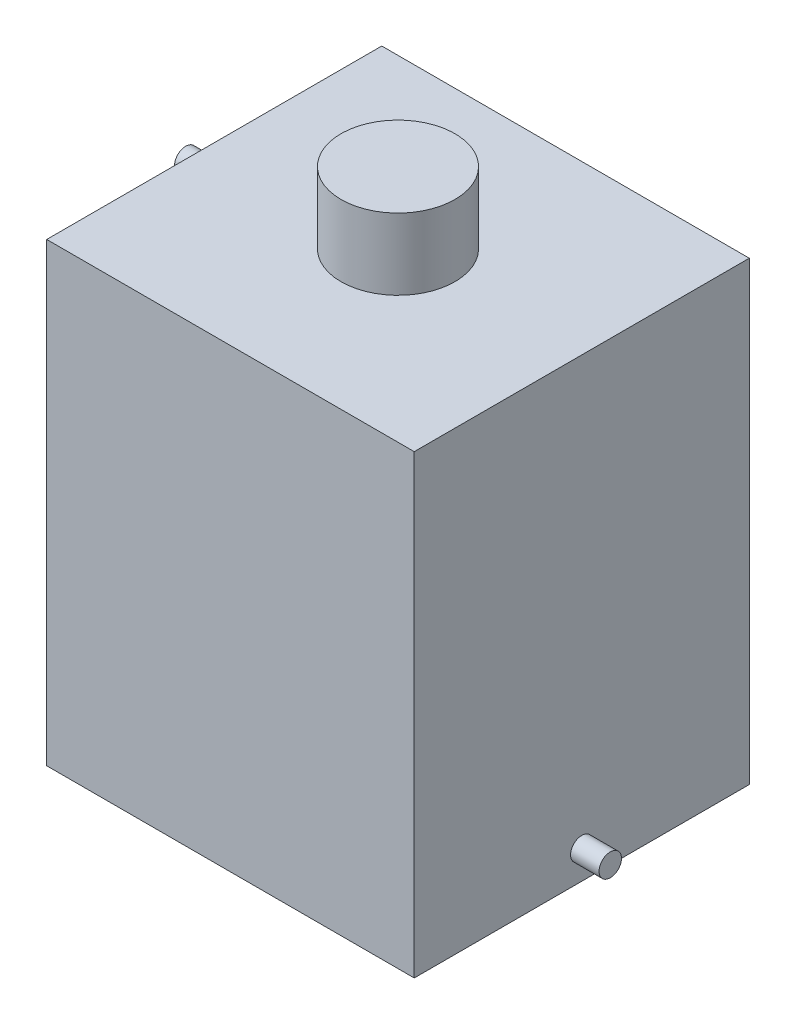
ISO-10303-21;
HEADER;
FILE_DESCRIPTION(('STEP AP214'),'2;1');
FILE_NAME('part.step','',(''),(''),'','','');
FILE_SCHEMA(('AUTOMOTIVE_DESIGN { 1 0 10303 214 1 1 1 1 }'));
ENDSEC;
DATA;
#1=APPLICATION_CONTEXT('core data for automotive mechanical design processes');
#2=APPLICATION_PROTOCOL_DEFINITION('international standard','automotive_design',2000,#1);
#3=PRODUCT_CONTEXT('',#1,'mechanical');
#4=PRODUCT('Part','Part','',(#3));
#5=PRODUCT_RELATED_PRODUCT_CATEGORY('part','',(#4));
#6=PRODUCT_DEFINITION_FORMATION('','',#4);
#7=PRODUCT_DEFINITION_CONTEXT('part definition',#1,'design');
#8=PRODUCT_DEFINITION('design','',#6,#7);
#9=PRODUCT_DEFINITION_SHAPE('','',#8);
#10=(LENGTH_UNIT() NAMED_UNIT(*) SI_UNIT(.MILLI.,.METRE.));
#11=(NAMED_UNIT(*) PLANE_ANGLE_UNIT() SI_UNIT($,.RADIAN.));
#12=(NAMED_UNIT(*) SI_UNIT($,.STERADIAN.) SOLID_ANGLE_UNIT());
#13=UNCERTAINTY_MEASURE_WITH_UNIT(LENGTH_MEASURE(1.E-05),#10,'distance_accuracy_value','');
#14=(GEOMETRIC_REPRESENTATION_CONTEXT(3) GLOBAL_UNCERTAINTY_ASSIGNED_CONTEXT((#13)) GLOBAL_UNIT_ASSIGNED_CONTEXT((#10,
#11,#12)) REPRESENTATION_CONTEXT('',''));
#15=CARTESIAN_POINT('',(0.,0.,0.));
#16=DIRECTION('',(0.,0.,1.));
#17=DIRECTION('',(1.,0.,0.));
#18=AXIS2_PLACEMENT_3D('',#15,#16,#17);
#19=CARTESIAN_POINT('',(-81.915,203.2,-74.676));
#20=DIRECTION('',(1.,0.,0.));
#21=DIRECTION('',(0.,0.,-1.));
#22=AXIS2_PLACEMENT_3D('',#19,#20,#21);
#23=PLANE('',#22);
#24=CARTESIAN_POINT('',(-81.915,190.5,0.));
#25=DIRECTION('',(1.,0.,0.));
#26=DIRECTION('',(0.,0.,-1.));
#27=AXIS2_PLACEMENT_3D('',#24,#25,#26);
#28=CIRCLE('',#27,5.);
#29=CARTESIAN_POINT('',(-81.915,190.5,-5.));
#30=VERTEX_POINT('',#29);
#31=EDGE_CURVE('E50',#30,#30,#28,.F.);
#32=ORIENTED_EDGE('',*,*,#31,.F.);
#33=EDGE_LOOP('',(#32));
#34=FACE_BOUND('',#33,.T.);
#35=DIRECTION('',(0.,0.,1.));
#36=VECTOR('',#35,1.);
#37=CARTESIAN_POINT('',(-81.915,0.,-74.676));
#38=LINE('',#37,#36);
#39=CARTESIAN_POINT('',(-81.915,0.,-74.676));
#40=VERTEX_POINT('',#39);
#41=CARTESIAN_POINT('',(-81.915,0.,74.676));
#42=VERTEX_POINT('',#41);
#43=EDGE_CURVE('E113',#40,#42,#38,.T.);
#44=ORIENTED_EDGE('',*,*,#43,.T.);
#45=DIRECTION('',(0.,-1.,0.));
#46=VECTOR('',#45,1.);
#47=CARTESIAN_POINT('',(-81.915,203.2,74.676));
#48=LINE('',#47,#46);
#49=CARTESIAN_POINT('',(-81.915,203.2,74.676));
#50=VERTEX_POINT('',#49);
#51=EDGE_CURVE('E102',#50,#42,#48,.T.);
#52=ORIENTED_EDGE('',*,*,#51,.F.);
#53=DIRECTION('',(0.,0.,1.));
#54=VECTOR('',#53,1.);
#55=CARTESIAN_POINT('',(-81.915,203.2,-74.676));
#56=LINE('',#55,#54);
#57=CARTESIAN_POINT('',(-81.915,203.2,-74.676));
#58=VERTEX_POINT('',#57);
#59=EDGE_CURVE('E94',#58,#50,#56,.T.);
#60=ORIENTED_EDGE('',*,*,#59,.F.);
#61=DIRECTION('',(0.,-1.,0.));
#62=VECTOR('',#61,1.);
#63=CARTESIAN_POINT('',(-81.915,203.2,-74.676));
#64=LINE('',#63,#62);
#65=EDGE_CURVE('E109',#58,#40,#64,.T.);
#66=ORIENTED_EDGE('',*,*,#65,.T.);
#67=EDGE_LOOP('',(#44,#52,#60,#66));
#68=FACE_BOUND('',#67,.T.);
#69=ADVANCED_FACE('F41',(#34,#68),#23,.F.);
#70=CARTESIAN_POINT('',(81.915,203.2,74.676));
#71=DIRECTION('',(0.,0.,-1.));
#72=DIRECTION('',(-1.,0.,0.));
#73=AXIS2_PLACEMENT_3D('',#70,#71,#72);
#74=PLANE('',#73);
#75=DIRECTION('',(1.,0.,0.));
#76=VECTOR('',#75,1.);
#77=CARTESIAN_POINT('',(81.915,0.,74.676));
#78=LINE('',#77,#76);
#79=CARTESIAN_POINT('',(81.915,0.,74.676));
#80=VERTEX_POINT('',#79);
#81=EDGE_CURVE('E100',#42,#80,#78,.T.);
#82=ORIENTED_EDGE('',*,*,#81,.T.);
#83=DIRECTION('',(0.,-1.,0.));
#84=VECTOR('',#83,1.);
#85=CARTESIAN_POINT('',(81.915,203.2,74.676));
#86=LINE('',#85,#84);
#87=CARTESIAN_POINT('',(81.915,203.2,74.676));
#88=VERTEX_POINT('',#87);
#89=EDGE_CURVE('E98',#88,#80,#86,.T.);
#90=ORIENTED_EDGE('',*,*,#89,.F.);
#91=DIRECTION('',(1.,0.,0.));
#92=VECTOR('',#91,1.);
#93=CARTESIAN_POINT('',(81.915,203.2,74.676));
#94=LINE('',#93,#92);
#95=EDGE_CURVE('E89',#50,#88,#94,.T.);
#96=ORIENTED_EDGE('',*,*,#95,.F.);
#97=ORIENTED_EDGE('',*,*,#51,.T.);
#98=EDGE_LOOP('',(#82,#90,#96,#97));
#99=FACE_BOUND('',#98,.T.);
#100=ADVANCED_FACE('F99',(#99),#74,.F.);
#101=CARTESIAN_POINT('',(81.915,203.2,-74.676));
#102=DIRECTION('',(-1.,0.,0.));
#103=DIRECTION('',(0.,0.,1.));
#104=AXIS2_PLACEMENT_3D('',#101,#102,#103);
#105=PLANE('',#104);
#106=CARTESIAN_POINT('',(81.915,12.7,0.));
#107=DIRECTION('',(-1.,0.,0.));
#108=DIRECTION('',(0.,0.,1.));
#109=AXIS2_PLACEMENT_3D('',#106,#107,#108);
#110=CIRCLE('',#109,5.);
#111=CARTESIAN_POINT('',(81.915,12.7,5.));
#112=VERTEX_POINT('',#111);
#113=EDGE_CURVE('E11',#112,#112,#110,.F.);
#114=ORIENTED_EDGE('',*,*,#113,.F.);
#115=EDGE_LOOP('',(#114));
#116=FACE_BOUND('',#115,.T.);
#117=DIRECTION('',(0.,0.,-1.));
#118=VECTOR('',#117,1.);
#119=CARTESIAN_POINT('',(81.915,0.,-74.676));
#120=LINE('',#119,#118);
#121=CARTESIAN_POINT('',(81.915,0.,-74.676));
#122=VERTEX_POINT('',#121);
#123=EDGE_CURVE('E75',#80,#122,#120,.T.);
#124=ORIENTED_EDGE('',*,*,#123,.T.);
#125=DIRECTION('',(0.,-1.,0.));
#126=VECTOR('',#125,1.);
#127=CARTESIAN_POINT('',(81.915,203.2,-74.676));
#128=LINE('',#127,#126);
#129=CARTESIAN_POINT('',(81.915,203.2,-74.676));
#130=VERTEX_POINT('',#129);
#131=EDGE_CURVE('E103',#130,#122,#128,.T.);
#132=ORIENTED_EDGE('',*,*,#131,.F.);
#133=DIRECTION('',(0.,0.,-1.));
#134=VECTOR('',#133,1.);
#135=CARTESIAN_POINT('',(81.915,203.2,-74.676));
#136=LINE('',#135,#134);
#137=EDGE_CURVE('E92',#88,#130,#136,.T.);
#138=ORIENTED_EDGE('',*,*,#137,.F.);
#139=ORIENTED_EDGE('',*,*,#89,.T.);
#140=EDGE_LOOP('',(#124,#132,#138,#139));
#141=FACE_BOUND('',#140,.T.);
#142=ADVANCED_FACE('F105',(#116,#141),#105,.F.);
#143=CARTESIAN_POINT('',(81.915,203.2,-74.676));
#144=DIRECTION('',(0.,0.,1.));
#145=DIRECTION('',(1.,0.,0.));
#146=AXIS2_PLACEMENT_3D('',#143,#144,#145);
#147=PLANE('',#146);
#148=DIRECTION('',(-1.,0.,0.));
#149=VECTOR('',#148,1.);
#150=CARTESIAN_POINT('',(81.915,0.,-74.676));
#151=LINE('',#150,#149);
#152=EDGE_CURVE('E81',#122,#40,#151,.T.);
#153=ORIENTED_EDGE('',*,*,#152,.T.);
#154=ORIENTED_EDGE('',*,*,#65,.F.);
#155=DIRECTION('',(-1.,0.,0.));
#156=VECTOR('',#155,1.);
#157=CARTESIAN_POINT('',(81.915,203.2,-74.676));
#158=LINE('',#157,#156);
#159=EDGE_CURVE('E58',#130,#58,#158,.T.);
#160=ORIENTED_EDGE('',*,*,#159,.F.);
#161=ORIENTED_EDGE('',*,*,#131,.T.);
#162=EDGE_LOOP('',(#153,#154,#160,#161));
#163=FACE_BOUND('',#162,.T.);
#164=ADVANCED_FACE('F163',(#163),#147,.F.);
#165=CARTESIAN_POINT('',(0.,203.2,0.));
#166=DIRECTION('',(0.,-1.,0.));
#167=DIRECTION('',(0.,0.,-1.));
#168=AXIS2_PLACEMENT_3D('',#165,#166,#167);
#169=PLANE('',#168);
#170=CARTESIAN_POINT('',(0.,203.2,0.));
#171=DIRECTION('',(0.,1.,0.));
#172=DIRECTION('',(0.,0.,1.));
#173=AXIS2_PLACEMENT_3D('',#170,#171,#172);
#174=CIRCLE('',#173,25.4);
#175=CARTESIAN_POINT('',(0.,203.2,25.4));
#176=VERTEX_POINT('',#175);
#177=EDGE_CURVE('E129',#176,#176,#174,.T.);
#178=ORIENTED_EDGE('',*,*,#177,.F.);
#179=EDGE_LOOP('',(#178));
#180=FACE_BOUND('',#179,.T.);
#181=ORIENTED_EDGE('',*,*,#59,.T.);
#182=ORIENTED_EDGE('',*,*,#95,.T.);
#183=ORIENTED_EDGE('',*,*,#137,.T.);
#184=ORIENTED_EDGE('',*,*,#159,.T.);
#185=EDGE_LOOP('',(#181,#182,#183,#184));
#186=FACE_BOUND('',#185,.T.);
#187=ADVANCED_FACE('F90',(#180,#186),#169,.F.);
#188=CARTESIAN_POINT('',(0.,0.,0.));
#189=DIRECTION('',(0.,-1.,0.));
#190=DIRECTION('',(0.,0.,-1.));
#191=AXIS2_PLACEMENT_3D('',#188,#189,#190);
#192=PLANE('',#191);
#193=ORIENTED_EDGE('',*,*,#43,.F.);
#194=ORIENTED_EDGE('',*,*,#152,.F.);
#195=ORIENTED_EDGE('',*,*,#123,.F.);
#196=ORIENTED_EDGE('',*,*,#81,.F.);
#197=EDGE_LOOP('',(#193,#194,#195,#196));
#198=FACE_BOUND('',#197,.T.);
#199=ADVANCED_FACE('F181',(#198),#192,.T.);
#200=CARTESIAN_POINT('',(0.,234.95,0.));
#201=DIRECTION('',(0.,-1.,0.));
#202=DIRECTION('',(0.,0.,-1.));
#203=AXIS2_PLACEMENT_3D('',#200,#201,#202);
#204=CYLINDRICAL_SURFACE('',#203,25.4);
#205=CARTESIAN_POINT('',(0.,234.95,0.));
#206=DIRECTION('',(0.,1.,0.));
#207=DIRECTION('',(0.,0.,1.));
#208=AXIS2_PLACEMENT_3D('',#205,#206,#207);
#209=CIRCLE('',#208,25.4);
#210=CARTESIAN_POINT('',(0.,234.95,25.4));
#211=VERTEX_POINT('',#210);
#212=EDGE_CURVE('E117',#211,#211,#209,.T.);
#213=ORIENTED_EDGE('',*,*,#212,.F.);
#214=EDGE_LOOP('',(#213));
#215=FACE_BOUND('',#214,.T.);
#216=ORIENTED_EDGE('',*,*,#177,.T.);
#217=EDGE_LOOP('',(#216));
#218=FACE_BOUND('',#217,.T.);
#219=ADVANCED_FACE('F183',(#215,#218),#204,.T.);
#220=CARTESIAN_POINT('',(0.,234.95,0.));
#221=DIRECTION('',(0.,1.,0.));
#222=DIRECTION('',(0.,0.,1.));
#223=AXIS2_PLACEMENT_3D('',#220,#221,#222);
#224=PLANE('',#223);
#225=ORIENTED_EDGE('',*,*,#212,.T.);
#226=EDGE_LOOP('',(#225));
#227=FACE_BOUND('',#226,.T.);
#228=ADVANCED_FACE('F189',(#227),#224,.T.);
#229=CARTESIAN_POINT('',(-94.615,190.5,0.));
#230=DIRECTION('',(1.,0.,0.));
#231=DIRECTION('',(0.,0.,-1.));
#232=AXIS2_PLACEMENT_3D('',#229,#230,#231);
#233=CYLINDRICAL_SURFACE('',#232,5.);
#234=CARTESIAN_POINT('',(-94.615,190.5,0.));
#235=DIRECTION('',(-1.,0.,0.));
#236=DIRECTION('',(0.,0.,1.));
#237=AXIS2_PLACEMENT_3D('',#234,#235,#236);
#238=CIRCLE('',#237,5.);
#239=CARTESIAN_POINT('',(-94.615,190.5,5.00000000000001));
#240=VERTEX_POINT('',#239);
#241=EDGE_CURVE('E145',#240,#240,#238,.T.);
#242=ORIENTED_EDGE('',*,*,#241,.F.);
#243=EDGE_LOOP('',(#242));
#244=FACE_BOUND('',#243,.T.);
#245=ORIENTED_EDGE('',*,*,#31,.T.);
#246=EDGE_LOOP('',(#245));
#247=FACE_BOUND('',#246,.T.);
#248=ADVANCED_FACE('F197',(#244,#247),#233,.T.);
#249=CARTESIAN_POINT('',(-94.615,190.5,0.));
#250=DIRECTION('',(-1.,0.,0.));
#251=DIRECTION('',(0.,0.,1.));
#252=AXIS2_PLACEMENT_3D('',#249,#250,#251);
#253=PLANE('',#252);
#254=ORIENTED_EDGE('',*,*,#241,.T.);
#255=EDGE_LOOP('',(#254));
#256=FACE_BOUND('',#255,.T.);
#257=ADVANCED_FACE('F158',(#256),#253,.T.);
#258=CARTESIAN_POINT('',(94.615,12.7,0.));
#259=DIRECTION('',(-1.,0.,0.));
#260=DIRECTION('',(0.,0.,1.));
#261=AXIS2_PLACEMENT_3D('',#258,#259,#260);
#262=CYLINDRICAL_SURFACE('',#261,5.);
#263=CARTESIAN_POINT('',(94.615,12.7,0.));
#264=DIRECTION('',(1.,0.,0.));
#265=DIRECTION('',(0.,0.,-1.));
#266=AXIS2_PLACEMENT_3D('',#263,#264,#265);
#267=CIRCLE('',#266,5.);
#268=CARTESIAN_POINT('',(94.615,12.7,-5.));
#269=VERTEX_POINT('',#268);
#270=EDGE_CURVE('E148',#269,#269,#267,.T.);
#271=ORIENTED_EDGE('',*,*,#270,.F.);
#272=EDGE_LOOP('',(#271));
#273=FACE_BOUND('',#272,.T.);
#274=ORIENTED_EDGE('',*,*,#113,.T.);
#275=EDGE_LOOP('',(#274));
#276=FACE_BOUND('',#275,.T.);
#277=ADVANCED_FACE('F155',(#273,#276),#262,.T.);
#278=CARTESIAN_POINT('',(94.615,12.7,0.));
#279=DIRECTION('',(1.,0.,0.));
#280=DIRECTION('',(0.,0.,-1.));
#281=AXIS2_PLACEMENT_3D('',#278,#279,#280);
#282=PLANE('',#281);
#283=ORIENTED_EDGE('',*,*,#270,.T.);
#284=EDGE_LOOP('',(#283));
#285=FACE_BOUND('',#284,.T.);
#286=ADVANCED_FACE('F153',(#285),#282,.T.);
#287=CLOSED_SHELL('',(#69,#100,#142,#164,#187,#199,#219,#228,#248,#257,#277,#286));
#288=MANIFOLD_SOLID_BREP('B2',#287);
#289=ADVANCED_BREP_SHAPE_REPRESENTATION('',(#18,#288),#14);
#290=SHAPE_DEFINITION_REPRESENTATION(#9,#289);
ENDSEC;
END-ISO-10303-21;
